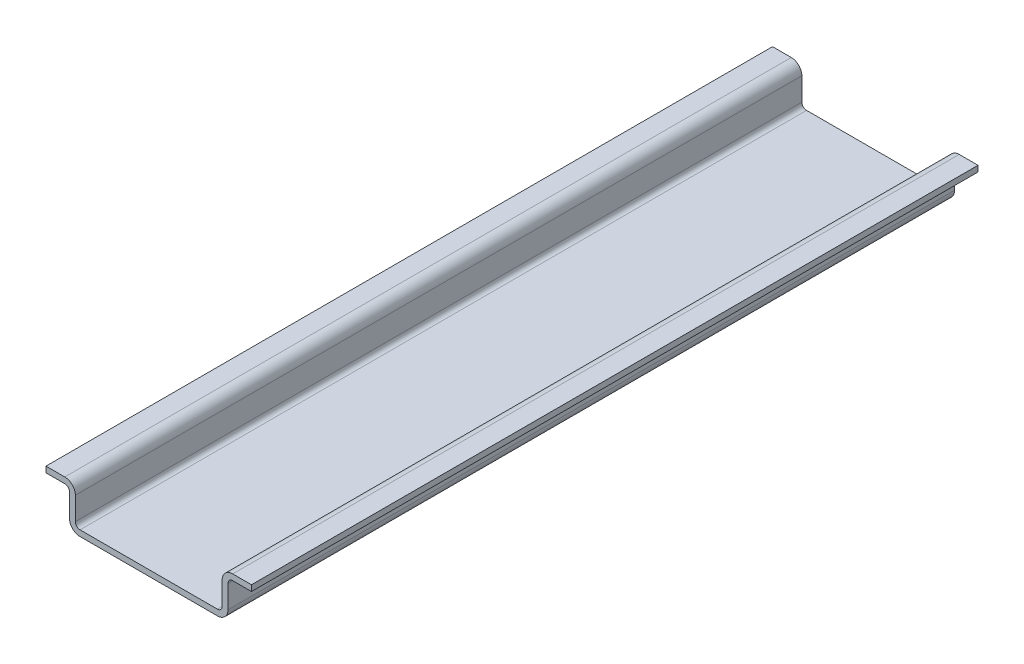
ISO-10303-21;
HEADER;
FILE_DESCRIPTION(('STEP AP214'),'2;1');
FILE_NAME('part.step','',(''),(''),'','','');
FILE_SCHEMA(('AUTOMOTIVE_DESIGN { 1 0 10303 214 1 1 1 1 }'));
ENDSEC;
DATA;
#1=APPLICATION_CONTEXT('core data for automotive mechanical design processes');
#2=APPLICATION_PROTOCOL_DEFINITION('international standard','automotive_design',2000,#1);
#3=PRODUCT_CONTEXT('',#1,'mechanical');
#4=PRODUCT('Part','Part','',(#3));
#5=PRODUCT_RELATED_PRODUCT_CATEGORY('part','',(#4));
#6=PRODUCT_DEFINITION_FORMATION('','',#4);
#7=PRODUCT_DEFINITION_CONTEXT('part definition',#1,'design');
#8=PRODUCT_DEFINITION('design','',#6,#7);
#9=PRODUCT_DEFINITION_SHAPE('','',#8);
#10=(LENGTH_UNIT() NAMED_UNIT(*) SI_UNIT(.MILLI.,.METRE.));
#11=(NAMED_UNIT(*) PLANE_ANGLE_UNIT() SI_UNIT($,.RADIAN.));
#12=(NAMED_UNIT(*) SI_UNIT($,.STERADIAN.) SOLID_ANGLE_UNIT());
#13=UNCERTAINTY_MEASURE_WITH_UNIT(LENGTH_MEASURE(1.E-05),#10,'distance_accuracy_value','');
#14=(GEOMETRIC_REPRESENTATION_CONTEXT(3) GLOBAL_UNCERTAINTY_ASSIGNED_CONTEXT((#13)) GLOBAL_UNIT_ASSIGNED_CONTEXT((#10,
#11,#12)) REPRESENTATION_CONTEXT('',''));
#15=CARTESIAN_POINT('',(0.,0.,0.));
#16=DIRECTION('',(0.,0.,1.));
#17=DIRECTION('',(1.,0.,0.));
#18=AXIS2_PLACEMENT_3D('',#15,#16,#17);
#19=CARTESIAN_POINT('',(17.5,6.5,-123.75));
#20=DIRECTION('',(-1.,0.,0.));
#21=DIRECTION('',(0.,0.,1.));
#22=AXIS2_PLACEMENT_3D('',#19,#20,#21);
#23=PLANE('',#22);
#24=DIRECTION('',(0.,-1.,0.));
#25=VECTOR('',#24,1.);
#26=CARTESIAN_POINT('',(17.5,6.5,0.));
#27=LINE('',#26,#25);
#28=CARTESIAN_POINT('',(17.5,7.5,0.));
#29=VERTEX_POINT('',#28);
#30=CARTESIAN_POINT('',(17.5,6.5,0.));
#31=VERTEX_POINT('',#30);
#32=EDGE_CURVE('E269',#29,#31,#27,.T.);
#33=ORIENTED_EDGE('',*,*,#32,.T.);
#34=DIRECTION('',(0.,0.,1.));
#35=VECTOR('',#34,1.);
#36=CARTESIAN_POINT('',(17.5,6.5,-123.75));
#37=LINE('',#36,#35);
#38=CARTESIAN_POINT('',(17.5,6.5,-123.75));
#39=VERTEX_POINT('',#38);
#40=EDGE_CURVE('E13',#39,#31,#37,.T.);
#41=ORIENTED_EDGE('',*,*,#40,.F.);
#42=DIRECTION('',(0.,-1.,0.));
#43=VECTOR('',#42,1.);
#44=CARTESIAN_POINT('',(17.5,6.5,-123.75));
#45=LINE('',#44,#43);
#46=CARTESIAN_POINT('',(17.5,7.5,-123.75));
#47=VERTEX_POINT('',#46);
#48=EDGE_CURVE('E307',#47,#39,#45,.T.);
#49=ORIENTED_EDGE('',*,*,#48,.F.);
#50=DIRECTION('',(0.,0.,1.));
#51=VECTOR('',#50,1.);
#52=CARTESIAN_POINT('',(17.5,7.5,-123.75));
#53=LINE('',#52,#51);
#54=EDGE_CURVE('E265',#47,#29,#53,.T.);
#55=ORIENTED_EDGE('',*,*,#54,.T.);
#56=EDGE_LOOP('',(#33,#41,#49,#55));
#57=FACE_BOUND('',#56,.T.);
#58=ADVANCED_FACE('F101',(#57),#23,.F.);
#59=CARTESIAN_POINT('',(14.3,6.5,-123.75));
#60=DIRECTION('',(0.,1.,0.));
#61=DIRECTION('',(-1.,0.,0.));
#62=AXIS2_PLACEMENT_3D('',#59,#60,#61);
#63=PLANE('',#62);
#64=DIRECTION('',(-1.,0.,0.));
#65=VECTOR('',#64,1.);
#66=CARTESIAN_POINT('',(14.3,6.5,0.));
#67=LINE('',#66,#65);
#68=CARTESIAN_POINT('',(14.3,6.5,0.));
#69=VERTEX_POINT('',#68);
#70=EDGE_CURVE('E272',#31,#69,#67,.T.);
#71=ORIENTED_EDGE('',*,*,#70,.T.);
#72=DIRECTION('',(0.,0.,1.));
#73=VECTOR('',#72,1.);
#74=CARTESIAN_POINT('',(14.3,6.5,-123.75));
#75=LINE('',#74,#73);
#76=CARTESIAN_POINT('',(14.3,6.5,-123.75));
#77=VERTEX_POINT('',#76);
#78=EDGE_CURVE('E109',#77,#69,#75,.T.);
#79=ORIENTED_EDGE('',*,*,#78,.F.);
#80=DIRECTION('',(-1.,0.,0.));
#81=VECTOR('',#80,1.);
#82=CARTESIAN_POINT('',(14.3,6.5,-123.75));
#83=LINE('',#82,#81);
#84=EDGE_CURVE('E196',#39,#77,#83,.T.);
#85=ORIENTED_EDGE('',*,*,#84,.F.);
#86=ORIENTED_EDGE('',*,*,#40,.T.);
#87=EDGE_LOOP('',(#71,#79,#85,#86));
#88=FACE_BOUND('',#87,.T.);
#89=ADVANCED_FACE('F425',(#88),#63,.F.);
#90=CARTESIAN_POINT('',(14.3,5.7,-123.75));
#91=DIRECTION('',(0.,0.,1.));
#92=DIRECTION('',(1.,0.,0.));
#93=AXIS2_PLACEMENT_3D('',#90,#91,#92);
#94=CYLINDRICAL_SURFACE('',#93,0.8);
#95=CARTESIAN_POINT('',(14.3,5.7,0.));
#96=DIRECTION('',(0.,0.,1.));
#97=DIRECTION('',(1.,0.,0.));
#98=AXIS2_PLACEMENT_3D('',#95,#96,#97);
#99=CIRCLE('',#98,0.8);
#100=CARTESIAN_POINT('',(13.5,5.69999999999999,0.));
#101=VERTEX_POINT('',#100);
#102=EDGE_CURVE('E274',#69,#101,#99,.T.);
#103=ORIENTED_EDGE('',*,*,#102,.T.);
#104=DIRECTION('',(0.,0.,1.));
#105=VECTOR('',#104,1.);
#106=CARTESIAN_POINT('',(13.5,5.69999999999999,-123.75));
#107=LINE('',#106,#105);
#108=CARTESIAN_POINT('',(13.5,5.69999999999999,-123.75));
#109=VERTEX_POINT('',#108);
#110=EDGE_CURVE('E350',#109,#101,#107,.T.);
#111=ORIENTED_EDGE('',*,*,#110,.F.);
#112=CARTESIAN_POINT('',(14.3,5.7,-123.75));
#113=DIRECTION('',(0.,0.,1.));
#114=DIRECTION('',(1.,0.,0.));
#115=AXIS2_PLACEMENT_3D('',#112,#113,#114);
#116=CIRCLE('',#115,0.8);
#117=EDGE_CURVE('E358',#77,#109,#116,.T.);
#118=ORIENTED_EDGE('',*,*,#117,.F.);
#119=ORIENTED_EDGE('',*,*,#78,.T.);
#120=EDGE_LOOP('',(#103,#111,#118,#119));
#121=FACE_BOUND('',#120,.T.);
#122=ADVANCED_FACE('F356',(#121),#94,.F.);
#123=CARTESIAN_POINT('',(13.5,1.80000000000001,-123.75));
#124=DIRECTION('',(-1.,0.,0.));
#125=DIRECTION('',(0.,0.,1.));
#126=AXIS2_PLACEMENT_3D('',#123,#124,#125);
#127=PLANE('',#126);
#128=DIRECTION('',(0.,-1.,0.));
#129=VECTOR('',#128,1.);
#130=CARTESIAN_POINT('',(13.5,1.80000000000001,0.));
#131=LINE('',#130,#129);
#132=CARTESIAN_POINT('',(13.5,1.80000000000001,0.));
#133=VERTEX_POINT('',#132);
#134=EDGE_CURVE('E276',#101,#133,#131,.T.);
#135=ORIENTED_EDGE('',*,*,#134,.T.);
#136=DIRECTION('',(0.,0.,1.));
#137=VECTOR('',#136,1.);
#138=CARTESIAN_POINT('',(13.5,1.80000000000001,-123.75));
#139=LINE('',#138,#137);
#140=CARTESIAN_POINT('',(13.5,1.80000000000001,-123.75));
#141=VERTEX_POINT('',#140);
#142=EDGE_CURVE('E347',#141,#133,#139,.T.);
#143=ORIENTED_EDGE('',*,*,#142,.F.);
#144=DIRECTION('',(0.,-1.,0.));
#145=VECTOR('',#144,1.);
#146=CARTESIAN_POINT('',(13.5,1.80000000000001,-123.75));
#147=LINE('',#146,#145);
#148=EDGE_CURVE('E376',#109,#141,#147,.T.);
#149=ORIENTED_EDGE('',*,*,#148,.F.);
#150=ORIENTED_EDGE('',*,*,#110,.T.);
#151=EDGE_LOOP('',(#135,#143,#149,#150));
#152=FACE_BOUND('',#151,.T.);
#153=ADVANCED_FACE('F367',(#152),#127,.F.);
#154=CARTESIAN_POINT('',(11.7,1.8,-123.75));
#155=DIRECTION('',(0.,0.,1.));
#156=DIRECTION('',(1.,0.,0.));
#157=AXIS2_PLACEMENT_3D('',#154,#155,#156);
#158=CYLINDRICAL_SURFACE('',#157,1.8);
#159=CARTESIAN_POINT('',(11.7,1.8,0.));
#160=DIRECTION('',(0.,0.,-1.));
#161=DIRECTION('',(1.,0.,0.));
#162=AXIS2_PLACEMENT_3D('',#159,#160,#161);
#163=CIRCLE('',#162,1.8);
#164=CARTESIAN_POINT('',(11.7,0.,0.));
#165=VERTEX_POINT('',#164);
#166=EDGE_CURVE('E278',#133,#165,#163,.T.);
#167=ORIENTED_EDGE('',*,*,#166,.T.);
#168=DIRECTION('',(0.,0.,1.));
#169=VECTOR('',#168,1.);
#170=CARTESIAN_POINT('',(11.7,0.,-123.75));
#171=LINE('',#170,#169);
#172=CARTESIAN_POINT('',(11.7,0.,-123.75));
#173=VERTEX_POINT('',#172);
#174=EDGE_CURVE('E344',#173,#165,#171,.T.);
#175=ORIENTED_EDGE('',*,*,#174,.F.);
#176=CARTESIAN_POINT('',(11.7,1.8,-123.75));
#177=DIRECTION('',(0.,0.,-1.));
#178=DIRECTION('',(1.,0.,0.));
#179=AXIS2_PLACEMENT_3D('',#176,#177,#178);
#180=CIRCLE('',#179,1.8);
#181=EDGE_CURVE('E373',#141,#173,#180,.T.);
#182=ORIENTED_EDGE('',*,*,#181,.F.);
#183=ORIENTED_EDGE('',*,*,#142,.T.);
#184=EDGE_LOOP('',(#167,#175,#182,#183));
#185=FACE_BOUND('',#184,.T.);
#186=ADVANCED_FACE('F371',(#185),#158,.T.);
#187=CARTESIAN_POINT('',(-11.7,0.,-123.75));
#188=DIRECTION('',(0.,1.,0.));
#189=DIRECTION('',(0.,0.,1.));
#190=AXIS2_PLACEMENT_3D('',#187,#188,#189);
#191=PLANE('',#190);
#192=DIRECTION('',(-1.,0.,0.));
#193=VECTOR('',#192,1.);
#194=CARTESIAN_POINT('',(-11.7,0.,0.));
#195=LINE('',#194,#193);
#196=CARTESIAN_POINT('',(-11.7,0.,0.));
#197=VERTEX_POINT('',#196);
#198=EDGE_CURVE('E280',#165,#197,#195,.T.);
#199=ORIENTED_EDGE('',*,*,#198,.T.);
#200=DIRECTION('',(0.,0.,1.));
#201=VECTOR('',#200,1.);
#202=CARTESIAN_POINT('',(-11.7,0.,-123.75));
#203=LINE('',#202,#201);
#204=CARTESIAN_POINT('',(-11.7,0.,-123.75));
#205=VERTEX_POINT('',#204);
#206=EDGE_CURVE('E341',#205,#197,#203,.T.);
#207=ORIENTED_EDGE('',*,*,#206,.F.);
#208=DIRECTION('',(-1.,0.,0.));
#209=VECTOR('',#208,1.);
#210=CARTESIAN_POINT('',(-11.7,0.,-123.75));
#211=LINE('',#210,#209);
#212=EDGE_CURVE('E375',#173,#205,#211,.T.);
#213=ORIENTED_EDGE('',*,*,#212,.F.);
#214=ORIENTED_EDGE('',*,*,#174,.T.);
#215=EDGE_LOOP('',(#199,#207,#213,#214));
#216=FACE_BOUND('',#215,.T.);
#217=ADVANCED_FACE('F438',(#216),#191,.F.);
#218=CARTESIAN_POINT('',(-11.7,1.8,-123.75));
#219=DIRECTION('',(0.,0.,1.));
#220=DIRECTION('',(1.,0.,0.));
#221=AXIS2_PLACEMENT_3D('',#218,#219,#220);
#222=CYLINDRICAL_SURFACE('',#221,1.8);
#223=CARTESIAN_POINT('',(-11.7,1.8,0.));
#224=DIRECTION('',(0.,0.,-1.));
#225=DIRECTION('',(-1.,0.,0.));
#226=AXIS2_PLACEMENT_3D('',#223,#224,#225);
#227=CIRCLE('',#226,1.8);
#228=CARTESIAN_POINT('',(-13.5,1.8,0.));
#229=VERTEX_POINT('',#228);
#230=EDGE_CURVE('E282',#197,#229,#227,.T.);
#231=ORIENTED_EDGE('',*,*,#230,.T.);
#232=DIRECTION('',(0.,0.,1.));
#233=VECTOR('',#232,1.);
#234=CARTESIAN_POINT('',(-13.5,1.8,-123.75));
#235=LINE('',#234,#233);
#236=CARTESIAN_POINT('',(-13.5,1.8,-123.75));
#237=VERTEX_POINT('',#236);
#238=EDGE_CURVE('E338',#237,#229,#235,.T.);
#239=ORIENTED_EDGE('',*,*,#238,.F.);
#240=CARTESIAN_POINT('',(-11.7,1.8,-123.75));
#241=DIRECTION('',(0.,0.,-1.));
#242=DIRECTION('',(-1.,0.,0.));
#243=AXIS2_PLACEMENT_3D('',#240,#241,#242);
#244=CIRCLE('',#243,1.8);
#245=EDGE_CURVE('E378',#205,#237,#244,.T.);
#246=ORIENTED_EDGE('',*,*,#245,.F.);
#247=ORIENTED_EDGE('',*,*,#206,.T.);
#248=EDGE_LOOP('',(#231,#239,#246,#247));
#249=FACE_BOUND('',#248,.T.);
#250=ADVANCED_FACE('F441',(#249),#222,.T.);
#251=CARTESIAN_POINT('',(-13.5,1.80000000000001,-123.75));
#252=DIRECTION('',(1.,0.,0.));
#253=DIRECTION('',(0.,0.,-1.));
#254=AXIS2_PLACEMENT_3D('',#251,#252,#253);
#255=PLANE('',#254);
#256=DIRECTION('',(0.,1.,0.));
#257=VECTOR('',#256,1.);
#258=CARTESIAN_POINT('',(-13.5,1.80000000000001,0.));
#259=LINE('',#258,#257);
#260=CARTESIAN_POINT('',(-13.5,5.69999999999999,0.));
#261=VERTEX_POINT('',#260);
#262=EDGE_CURVE('E284',#229,#261,#259,.T.);
#263=ORIENTED_EDGE('',*,*,#262,.T.);
#264=DIRECTION('',(0.,0.,1.));
#265=VECTOR('',#264,1.);
#266=CARTESIAN_POINT('',(-13.5,5.69999999999999,-123.75));
#267=LINE('',#266,#265);
#268=CARTESIAN_POINT('',(-13.5,5.69999999999999,-123.75));
#269=VERTEX_POINT('',#268);
#270=EDGE_CURVE('E335',#269,#261,#267,.T.);
#271=ORIENTED_EDGE('',*,*,#270,.F.);
#272=DIRECTION('',(0.,1.,0.));
#273=VECTOR('',#272,1.);
#274=CARTESIAN_POINT('',(-13.5,1.80000000000001,-123.75));
#275=LINE('',#274,#273);
#276=EDGE_CURVE('E384',#237,#269,#275,.T.);
#277=ORIENTED_EDGE('',*,*,#276,.F.);
#278=ORIENTED_EDGE('',*,*,#238,.T.);
#279=EDGE_LOOP('',(#263,#271,#277,#278));
#280=FACE_BOUND('',#279,.T.);
#281=ADVANCED_FACE('F445',(#280),#255,.F.);
#282=CARTESIAN_POINT('',(-14.3,5.7,-123.75));
#283=DIRECTION('',(0.,0.,1.));
#284=DIRECTION('',(1.,0.,0.));
#285=AXIS2_PLACEMENT_3D('',#282,#283,#284);
#286=CYLINDRICAL_SURFACE('',#285,0.8);
#287=CARTESIAN_POINT('',(-14.3,5.7,0.));
#288=DIRECTION('',(0.,0.,1.));
#289=DIRECTION('',(-1.,0.,0.));
#290=AXIS2_PLACEMENT_3D('',#287,#288,#289);
#291=CIRCLE('',#290,0.8);
#292=CARTESIAN_POINT('',(-14.3,6.5,0.));
#293=VERTEX_POINT('',#292);
#294=EDGE_CURVE('E286',#261,#293,#291,.T.);
#295=ORIENTED_EDGE('',*,*,#294,.T.);
#296=DIRECTION('',(0.,0.,1.));
#297=VECTOR('',#296,1.);
#298=CARTESIAN_POINT('',(-14.3,6.5,-123.75));
#299=LINE('',#298,#297);
#300=CARTESIAN_POINT('',(-14.3,6.5,-123.75));
#301=VERTEX_POINT('',#300);
#302=EDGE_CURVE('E332',#301,#293,#299,.T.);
#303=ORIENTED_EDGE('',*,*,#302,.F.);
#304=CARTESIAN_POINT('',(-14.3,5.7,-123.75));
#305=DIRECTION('',(0.,0.,1.));
#306=DIRECTION('',(-1.,0.,0.));
#307=AXIS2_PLACEMENT_3D('',#304,#305,#306);
#308=CIRCLE('',#307,0.8);
#309=EDGE_CURVE('E386',#269,#301,#308,.T.);
#310=ORIENTED_EDGE('',*,*,#309,.F.);
#311=ORIENTED_EDGE('',*,*,#270,.T.);
#312=EDGE_LOOP('',(#295,#303,#310,#311));
#313=FACE_BOUND('',#312,.T.);
#314=ADVANCED_FACE('F449',(#313),#286,.F.);
#315=CARTESIAN_POINT('',(-14.3,6.5,-123.75));
#316=DIRECTION('',(0.,1.,0.));
#317=DIRECTION('',(-1.,0.,0.));
#318=AXIS2_PLACEMENT_3D('',#315,#316,#317);
#319=PLANE('',#318);
#320=DIRECTION('',(-1.,0.,0.));
#321=VECTOR('',#320,1.);
#322=CARTESIAN_POINT('',(-14.3,6.5,0.));
#323=LINE('',#322,#321);
#324=CARTESIAN_POINT('',(-17.5,6.5,0.));
#325=VERTEX_POINT('',#324);
#326=EDGE_CURVE('E288',#293,#325,#323,.T.);
#327=ORIENTED_EDGE('',*,*,#326,.T.);
#328=DIRECTION('',(0.,0.,1.));
#329=VECTOR('',#328,1.);
#330=CARTESIAN_POINT('',(-17.5,6.5,-123.75));
#331=LINE('',#330,#329);
#332=CARTESIAN_POINT('',(-17.5,6.5,-123.75));
#333=VERTEX_POINT('',#332);
#334=EDGE_CURVE('E329',#333,#325,#331,.T.);
#335=ORIENTED_EDGE('',*,*,#334,.F.);
#336=DIRECTION('',(-1.,0.,0.));
#337=VECTOR('',#336,1.);
#338=CARTESIAN_POINT('',(-14.3,6.5,-123.75));
#339=LINE('',#338,#337);
#340=EDGE_CURVE('E388',#301,#333,#339,.T.);
#341=ORIENTED_EDGE('',*,*,#340,.F.);
#342=ORIENTED_EDGE('',*,*,#302,.T.);
#343=EDGE_LOOP('',(#327,#335,#341,#342));
#344=FACE_BOUND('',#343,.T.);
#345=ADVANCED_FACE('F453',(#344),#319,.F.);
#346=CARTESIAN_POINT('',(-17.5,6.5,-123.75));
#347=DIRECTION('',(1.,0.,0.));
#348=DIRECTION('',(0.,0.,-1.));
#349=AXIS2_PLACEMENT_3D('',#346,#347,#348);
#350=PLANE('',#349);
#351=DIRECTION('',(0.,1.,0.));
#352=VECTOR('',#351,1.);
#353=CARTESIAN_POINT('',(-17.5,6.5,0.));
#354=LINE('',#353,#352);
#355=CARTESIAN_POINT('',(-17.5,7.5,0.));
#356=VERTEX_POINT('',#355);
#357=EDGE_CURVE('E290',#325,#356,#354,.T.);
#358=ORIENTED_EDGE('',*,*,#357,.T.);
#359=DIRECTION('',(0.,0.,1.));
#360=VECTOR('',#359,1.);
#361=CARTESIAN_POINT('',(-17.5,7.5,-123.75));
#362=LINE('',#361,#360);
#363=CARTESIAN_POINT('',(-17.5,7.5,-123.75));
#364=VERTEX_POINT('',#363);
#365=EDGE_CURVE('E326',#364,#356,#362,.T.);
#366=ORIENTED_EDGE('',*,*,#365,.F.);
#367=DIRECTION('',(0.,1.,0.));
#368=VECTOR('',#367,1.);
#369=CARTESIAN_POINT('',(-17.5,6.5,-123.75));
#370=LINE('',#369,#368);
#371=EDGE_CURVE('E390',#333,#364,#370,.T.);
#372=ORIENTED_EDGE('',*,*,#371,.F.);
#373=ORIENTED_EDGE('',*,*,#334,.T.);
#374=EDGE_LOOP('',(#358,#366,#372,#373));
#375=FACE_BOUND('',#374,.T.);
#376=ADVANCED_FACE('F457',(#375),#350,.F.);
#377=CARTESIAN_POINT('',(-17.5,7.5,-123.75));
#378=DIRECTION('',(0.,-1.,0.));
#379=DIRECTION('',(0.,0.,-1.));
#380=AXIS2_PLACEMENT_3D('',#377,#378,#379);
#381=PLANE('',#380);
#382=DIRECTION('',(1.,0.,0.));
#383=VECTOR('',#382,1.);
#384=CARTESIAN_POINT('',(-17.5,7.5,0.));
#385=LINE('',#384,#383);
#386=CARTESIAN_POINT('',(-14.3,7.5,0.));
#387=VERTEX_POINT('',#386);
#388=EDGE_CURVE('E292',#356,#387,#385,.T.);
#389=ORIENTED_EDGE('',*,*,#388,.T.);
#390=DIRECTION('',(0.,0.,1.));
#391=VECTOR('',#390,1.);
#392=CARTESIAN_POINT('',(-14.3,7.5,-123.75));
#393=LINE('',#392,#391);
#394=CARTESIAN_POINT('',(-14.3,7.5,-123.75));
#395=VERTEX_POINT('',#394);
#396=EDGE_CURVE('E323',#395,#387,#393,.T.);
#397=ORIENTED_EDGE('',*,*,#396,.F.);
#398=DIRECTION('',(1.,0.,0.));
#399=VECTOR('',#398,1.);
#400=CARTESIAN_POINT('',(-17.5,7.5,-123.75));
#401=LINE('',#400,#399);
#402=EDGE_CURVE('E392',#364,#395,#401,.T.);
#403=ORIENTED_EDGE('',*,*,#402,.F.);
#404=ORIENTED_EDGE('',*,*,#365,.T.);
#405=EDGE_LOOP('',(#389,#397,#403,#404));
#406=FACE_BOUND('',#405,.T.);
#407=ADVANCED_FACE('F461',(#406),#381,.F.);
#408=CARTESIAN_POINT('',(-14.3,5.7,-123.75));
#409=DIRECTION('',(0.,0.,1.));
#410=DIRECTION('',(1.,0.,0.));
#411=AXIS2_PLACEMENT_3D('',#408,#409,#410);
#412=CYLINDRICAL_SURFACE('',#411,1.8);
#413=CARTESIAN_POINT('',(-14.3,5.7,0.));
#414=DIRECTION('',(0.,0.,-1.));
#415=DIRECTION('',(-1.,0.,0.));
#416=AXIS2_PLACEMENT_3D('',#413,#414,#415);
#417=CIRCLE('',#416,1.8);
#418=CARTESIAN_POINT('',(-12.5,5.7,0.));
#419=VERTEX_POINT('',#418);
#420=EDGE_CURVE('E294',#387,#419,#417,.T.);
#421=ORIENTED_EDGE('',*,*,#420,.T.);
#422=DIRECTION('',(0.,0.,1.));
#423=VECTOR('',#422,1.);
#424=CARTESIAN_POINT('',(-12.5,5.7,-123.75));
#425=LINE('',#424,#423);
#426=CARTESIAN_POINT('',(-12.5,5.7,-123.75));
#427=VERTEX_POINT('',#426);
#428=EDGE_CURVE('E320',#427,#419,#425,.T.);
#429=ORIENTED_EDGE('',*,*,#428,.F.);
#430=CARTESIAN_POINT('',(-14.3,5.7,-123.75));
#431=DIRECTION('',(0.,0.,-1.));
#432=DIRECTION('',(-1.,0.,0.));
#433=AXIS2_PLACEMENT_3D('',#430,#431,#432);
#434=CIRCLE('',#433,1.8);
#435=EDGE_CURVE('E394',#395,#427,#434,.T.);
#436=ORIENTED_EDGE('',*,*,#435,.F.);
#437=ORIENTED_EDGE('',*,*,#396,.T.);
#438=EDGE_LOOP('',(#421,#429,#436,#437));
#439=FACE_BOUND('',#438,.T.);
#440=ADVANCED_FACE('F465',(#439),#412,.T.);
#441=CARTESIAN_POINT('',(-12.5,5.7,-123.75));
#442=DIRECTION('',(-1.,0.,0.));
#443=DIRECTION('',(0.,-1.,0.));
#444=AXIS2_PLACEMENT_3D('',#441,#442,#443);
#445=PLANE('',#444);
#446=DIRECTION('',(0.,-1.,0.));
#447=VECTOR('',#446,1.);
#448=CARTESIAN_POINT('',(-12.5,5.7,0.));
#449=LINE('',#448,#447);
#450=CARTESIAN_POINT('',(-12.5,1.8,0.));
#451=VERTEX_POINT('',#450);
#452=EDGE_CURVE('E296',#419,#451,#449,.T.);
#453=ORIENTED_EDGE('',*,*,#452,.T.);
#454=DIRECTION('',(0.,0.,1.));
#455=VECTOR('',#454,1.);
#456=CARTESIAN_POINT('',(-12.5,1.8,-123.75));
#457=LINE('',#456,#455);
#458=CARTESIAN_POINT('',(-12.5,1.8,-123.75));
#459=VERTEX_POINT('',#458);
#460=EDGE_CURVE('E317',#459,#451,#457,.T.);
#461=ORIENTED_EDGE('',*,*,#460,.F.);
#462=DIRECTION('',(0.,-1.,0.));
#463=VECTOR('',#462,1.);
#464=CARTESIAN_POINT('',(-12.5,5.7,-123.75));
#465=LINE('',#464,#463);
#466=EDGE_CURVE('E396',#427,#459,#465,.T.);
#467=ORIENTED_EDGE('',*,*,#466,.F.);
#468=ORIENTED_EDGE('',*,*,#428,.T.);
#469=EDGE_LOOP('',(#453,#461,#467,#468));
#470=FACE_BOUND('',#469,.T.);
#471=ADVANCED_FACE('F469',(#470),#445,.F.);
#472=CARTESIAN_POINT('',(-11.7,1.8,-123.75));
#473=DIRECTION('',(0.,0.,1.));
#474=DIRECTION('',(1.,0.,0.));
#475=AXIS2_PLACEMENT_3D('',#472,#473,#474);
#476=CYLINDRICAL_SURFACE('',#475,0.8);
#477=CARTESIAN_POINT('',(-11.7,1.8,0.));
#478=DIRECTION('',(0.,0.,1.));
#479=DIRECTION('',(1.,0.,0.));
#480=AXIS2_PLACEMENT_3D('',#477,#478,#479);
#481=CIRCLE('',#480,0.8);
#482=CARTESIAN_POINT('',(-11.7,0.999999999999998,0.));
#483=VERTEX_POINT('',#482);
#484=EDGE_CURVE('E298',#451,#483,#481,.T.);
#485=ORIENTED_EDGE('',*,*,#484,.T.);
#486=DIRECTION('',(0.,0.,1.));
#487=VECTOR('',#486,1.);
#488=CARTESIAN_POINT('',(-11.7,0.999999999999998,-123.75));
#489=LINE('',#488,#487);
#490=CARTESIAN_POINT('',(-11.7,0.999999999999998,-123.75));
#491=VERTEX_POINT('',#490);
#492=EDGE_CURVE('E314',#491,#483,#489,.T.);
#493=ORIENTED_EDGE('',*,*,#492,.F.);
#494=CARTESIAN_POINT('',(-11.7,1.8,-123.75));
#495=DIRECTION('',(0.,0.,1.));
#496=DIRECTION('',(1.,0.,0.));
#497=AXIS2_PLACEMENT_3D('',#494,#495,#496);
#498=CIRCLE('',#497,0.8);
#499=EDGE_CURVE('E398',#459,#491,#498,.T.);
#500=ORIENTED_EDGE('',*,*,#499,.F.);
#501=ORIENTED_EDGE('',*,*,#460,.T.);
#502=EDGE_LOOP('',(#485,#493,#500,#501));
#503=FACE_BOUND('',#502,.T.);
#504=ADVANCED_FACE('F473',(#503),#476,.F.);
#505=CARTESIAN_POINT('',(11.7,0.999999999999999,-123.75));
#506=DIRECTION('',(0.,-1.,0.));
#507=DIRECTION('',(0.,0.,-1.));
#508=AXIS2_PLACEMENT_3D('',#505,#506,#507);
#509=PLANE('',#508);
#510=DIRECTION('',(1.,0.,0.));
#511=VECTOR('',#510,1.);
#512=CARTESIAN_POINT('',(11.7,0.999999999999999,0.));
#513=LINE('',#512,#511);
#514=CARTESIAN_POINT('',(11.7,0.999999999999999,0.));
#515=VERTEX_POINT('',#514);
#516=EDGE_CURVE('E300',#483,#515,#513,.T.);
#517=ORIENTED_EDGE('',*,*,#516,.T.);
#518=DIRECTION('',(0.,0.,1.));
#519=VECTOR('',#518,1.);
#520=CARTESIAN_POINT('',(11.7,0.999999999999999,-123.75));
#521=LINE('',#520,#519);
#522=CARTESIAN_POINT('',(11.7,0.999999999999999,-123.75));
#523=VERTEX_POINT('',#522);
#524=EDGE_CURVE('E311',#523,#515,#521,.T.);
#525=ORIENTED_EDGE('',*,*,#524,.F.);
#526=DIRECTION('',(1.,0.,0.));
#527=VECTOR('',#526,1.);
#528=CARTESIAN_POINT('',(11.7,0.999999999999999,-123.75));
#529=LINE('',#528,#527);
#530=EDGE_CURVE('E400',#491,#523,#529,.T.);
#531=ORIENTED_EDGE('',*,*,#530,.F.);
#532=ORIENTED_EDGE('',*,*,#492,.T.);
#533=EDGE_LOOP('',(#517,#525,#531,#532));
#534=FACE_BOUND('',#533,.T.);
#535=ADVANCED_FACE('F406',(#534),#509,.F.);
#536=CARTESIAN_POINT('',(11.7,1.8,-123.75));
#537=DIRECTION('',(0.,0.,1.));
#538=DIRECTION('',(1.,0.,0.));
#539=AXIS2_PLACEMENT_3D('',#536,#537,#538);
#540=CYLINDRICAL_SURFACE('',#539,0.8);
#541=CARTESIAN_POINT('',(11.7,1.8,0.));
#542=DIRECTION('',(0.,0.,1.));
#543=DIRECTION('',(-1.,0.,0.));
#544=AXIS2_PLACEMENT_3D('',#541,#542,#543);
#545=CIRCLE('',#544,0.8);
#546=CARTESIAN_POINT('',(12.5,1.8,0.));
#547=VERTEX_POINT('',#546);
#548=EDGE_CURVE('E302',#515,#547,#545,.T.);
#549=ORIENTED_EDGE('',*,*,#548,.T.);
#550=DIRECTION('',(0.,0.,1.));
#551=VECTOR('',#550,1.);
#552=CARTESIAN_POINT('',(12.5,1.8,-123.75));
#553=LINE('',#552,#551);
#554=CARTESIAN_POINT('',(12.5,1.8,-123.75));
#555=VERTEX_POINT('',#554);
#556=EDGE_CURVE('E260',#555,#547,#553,.T.);
#557=ORIENTED_EDGE('',*,*,#556,.F.);
#558=CARTESIAN_POINT('',(11.7,1.8,-123.75));
#559=DIRECTION('',(0.,0.,1.));
#560=DIRECTION('',(-1.,0.,0.));
#561=AXIS2_PLACEMENT_3D('',#558,#559,#560);
#562=CIRCLE('',#561,0.8);
#563=EDGE_CURVE('E251',#523,#555,#562,.T.);
#564=ORIENTED_EDGE('',*,*,#563,.F.);
#565=ORIENTED_EDGE('',*,*,#524,.T.);
#566=EDGE_LOOP('',(#549,#557,#564,#565));
#567=FACE_BOUND('',#566,.T.);
#568=ADVANCED_FACE('F410',(#567),#540,.F.);
#569=CARTESIAN_POINT('',(12.5,5.7,-123.75));
#570=DIRECTION('',(1.,0.,0.));
#571=DIRECTION('',(0.,1.,0.));
#572=AXIS2_PLACEMENT_3D('',#569,#570,#571);
#573=PLANE('',#572);
#574=DIRECTION('',(0.,1.,0.));
#575=VECTOR('',#574,1.);
#576=CARTESIAN_POINT('',(12.5,5.7,0.));
#577=LINE('',#576,#575);
#578=CARTESIAN_POINT('',(12.5,5.7,0.));
#579=VERTEX_POINT('',#578);
#580=EDGE_CURVE('E259',#547,#579,#577,.T.);
#581=ORIENTED_EDGE('',*,*,#580,.T.);
#582=DIRECTION('',(0.,0.,1.));
#583=VECTOR('',#582,1.);
#584=CARTESIAN_POINT('',(12.5,5.7,-123.75));
#585=LINE('',#584,#583);
#586=CARTESIAN_POINT('',(12.5,5.7,-123.75));
#587=VERTEX_POINT('',#586);
#588=EDGE_CURVE('E256',#587,#579,#585,.T.);
#589=ORIENTED_EDGE('',*,*,#588,.F.);
#590=DIRECTION('',(0.,1.,0.));
#591=VECTOR('',#590,1.);
#592=CARTESIAN_POINT('',(12.5,5.7,-123.75));
#593=LINE('',#592,#591);
#594=EDGE_CURVE('E245',#555,#587,#593,.T.);
#595=ORIENTED_EDGE('',*,*,#594,.F.);
#596=ORIENTED_EDGE('',*,*,#556,.T.);
#597=EDGE_LOOP('',(#581,#589,#595,#596));
#598=FACE_BOUND('',#597,.T.);
#599=ADVANCED_FACE('F257',(#598),#573,.F.);
#600=CARTESIAN_POINT('',(14.3,5.7,-123.75));
#601=DIRECTION('',(0.,0.,1.));
#602=DIRECTION('',(1.,0.,0.));
#603=AXIS2_PLACEMENT_3D('',#600,#601,#602);
#604=CYLINDRICAL_SURFACE('',#603,1.8);
#605=CARTESIAN_POINT('',(14.3,5.7,0.));
#606=DIRECTION('',(0.,0.,-1.));
#607=DIRECTION('',(1.,0.,0.));
#608=AXIS2_PLACEMENT_3D('',#605,#606,#607);
#609=CIRCLE('',#608,1.8);
#610=CARTESIAN_POINT('',(14.3,7.5,0.));
#611=VERTEX_POINT('',#610);
#612=EDGE_CURVE('E182',#579,#611,#609,.T.);
#613=ORIENTED_EDGE('',*,*,#612,.T.);
#614=DIRECTION('',(0.,0.,1.));
#615=VECTOR('',#614,1.);
#616=CARTESIAN_POINT('',(14.3,7.5,-123.75));
#617=LINE('',#616,#615);
#618=CARTESIAN_POINT('',(14.3,7.5,-123.75));
#619=VERTEX_POINT('',#618);
#620=EDGE_CURVE('E261',#619,#611,#617,.T.);
#621=ORIENTED_EDGE('',*,*,#620,.F.);
#622=CARTESIAN_POINT('',(14.3,5.7,-123.75));
#623=DIRECTION('',(0.,0.,-1.));
#624=DIRECTION('',(1.,0.,0.));
#625=AXIS2_PLACEMENT_3D('',#622,#623,#624);
#626=CIRCLE('',#625,1.8);
#627=EDGE_CURVE('E249',#587,#619,#626,.T.);
#628=ORIENTED_EDGE('',*,*,#627,.F.);
#629=ORIENTED_EDGE('',*,*,#588,.T.);
#630=EDGE_LOOP('',(#613,#621,#628,#629));
#631=FACE_BOUND('',#630,.T.);
#632=ADVANCED_FACE('F263',(#631),#604,.T.);
#633=CARTESIAN_POINT('',(17.5,7.5,-123.75));
#634=DIRECTION('',(0.,-1.,0.));
#635=DIRECTION('',(0.,0.,-1.));
#636=AXIS2_PLACEMENT_3D('',#633,#634,#635);
#637=PLANE('',#636);
#638=DIRECTION('',(1.,0.,0.));
#639=VECTOR('',#638,1.);
#640=CARTESIAN_POINT('',(17.5,7.5,0.));
#641=LINE('',#640,#639);
#642=EDGE_CURVE('E188',#611,#29,#641,.T.);
#643=ORIENTED_EDGE('',*,*,#642,.T.);
#644=ORIENTED_EDGE('',*,*,#54,.F.);
#645=DIRECTION('',(1.,0.,0.));
#646=VECTOR('',#645,1.);
#647=CARTESIAN_POINT('',(17.5,7.5,-123.75));
#648=LINE('',#647,#646);
#649=EDGE_CURVE('E117',#619,#47,#648,.T.);
#650=ORIENTED_EDGE('',*,*,#649,.F.);
#651=ORIENTED_EDGE('',*,*,#620,.T.);
#652=EDGE_LOOP('',(#643,#644,#650,#651));
#653=FACE_BOUND('',#652,.T.);
#654=ADVANCED_FACE('F414',(#653),#637,.F.);
#655=CARTESIAN_POINT('',(14.3,5.7,-123.75));
#656=DIRECTION('',(0.,0.,1.));
#657=DIRECTION('',(1.,0.,0.));
#658=AXIS2_PLACEMENT_3D('',#655,#656,#657);
#659=PLANE('',#658);
#660=ORIENTED_EDGE('',*,*,#48,.T.);
#661=ORIENTED_EDGE('',*,*,#84,.T.);
#662=ORIENTED_EDGE('',*,*,#117,.T.);
#663=ORIENTED_EDGE('',*,*,#148,.T.);
#664=ORIENTED_EDGE('',*,*,#181,.T.);
#665=ORIENTED_EDGE('',*,*,#212,.T.);
#666=ORIENTED_EDGE('',*,*,#245,.T.);
#667=ORIENTED_EDGE('',*,*,#276,.T.);
#668=ORIENTED_EDGE('',*,*,#309,.T.);
#669=ORIENTED_EDGE('',*,*,#340,.T.);
#670=ORIENTED_EDGE('',*,*,#371,.T.);
#671=ORIENTED_EDGE('',*,*,#402,.T.);
#672=ORIENTED_EDGE('',*,*,#435,.T.);
#673=ORIENTED_EDGE('',*,*,#466,.T.);
#674=ORIENTED_EDGE('',*,*,#499,.T.);
#675=ORIENTED_EDGE('',*,*,#530,.T.);
#676=ORIENTED_EDGE('',*,*,#563,.T.);
#677=ORIENTED_EDGE('',*,*,#594,.T.);
#678=ORIENTED_EDGE('',*,*,#627,.T.);
#679=ORIENTED_EDGE('',*,*,#649,.T.);
#680=EDGE_LOOP('',(#660,#661,#662,#663,#664,#665,#666,#667,#668,#669,#670,#671,#672,#673,#674,
#675,#676,#677,#678,#679));
#681=FACE_BOUND('',#680,.T.);
#682=ADVANCED_FACE('F247',(#681),#659,.F.);
#683=CARTESIAN_POINT('',(14.3,5.7,0.));
#684=DIRECTION('',(0.,0.,1.));
#685=DIRECTION('',(1.,0.,0.));
#686=AXIS2_PLACEMENT_3D('',#683,#684,#685);
#687=PLANE('',#686);
#688=ORIENTED_EDGE('',*,*,#32,.F.);
#689=ORIENTED_EDGE('',*,*,#642,.F.);
#690=ORIENTED_EDGE('',*,*,#612,.F.);
#691=ORIENTED_EDGE('',*,*,#580,.F.);
#692=ORIENTED_EDGE('',*,*,#548,.F.);
#693=ORIENTED_EDGE('',*,*,#516,.F.);
#694=ORIENTED_EDGE('',*,*,#484,.F.);
#695=ORIENTED_EDGE('',*,*,#452,.F.);
#696=ORIENTED_EDGE('',*,*,#420,.F.);
#697=ORIENTED_EDGE('',*,*,#388,.F.);
#698=ORIENTED_EDGE('',*,*,#357,.F.);
#699=ORIENTED_EDGE('',*,*,#326,.F.);
#700=ORIENTED_EDGE('',*,*,#294,.F.);
#701=ORIENTED_EDGE('',*,*,#262,.F.);
#702=ORIENTED_EDGE('',*,*,#230,.F.);
#703=ORIENTED_EDGE('',*,*,#198,.F.);
#704=ORIENTED_EDGE('',*,*,#166,.F.);
#705=ORIENTED_EDGE('',*,*,#134,.F.);
#706=ORIENTED_EDGE('',*,*,#102,.F.);
#707=ORIENTED_EDGE('',*,*,#70,.F.);
#708=EDGE_LOOP('',(#688,#689,#690,#691,#692,#693,#694,#695,#696,#697,#698,#699,#700,#701,#702,
#703,#704,#705,#706,#707));
#709=FACE_BOUND('',#708,.T.);
#710=ADVANCED_FACE('F362',(#709),#687,.T.);
#711=CLOSED_SHELL('',(#58,#89,#122,#153,#186,#217,#250,#281,#314,#345,#376,#407,#440,#471,#504,
#535,#568,#599,#632,#654,#682,#710));
#712=MANIFOLD_SOLID_BREP('B2',#711);
#713=ADVANCED_BREP_SHAPE_REPRESENTATION('',(#18,#712),#14);
#714=SHAPE_DEFINITION_REPRESENTATION(#9,#713);
ENDSEC;
END-ISO-10303-21;
